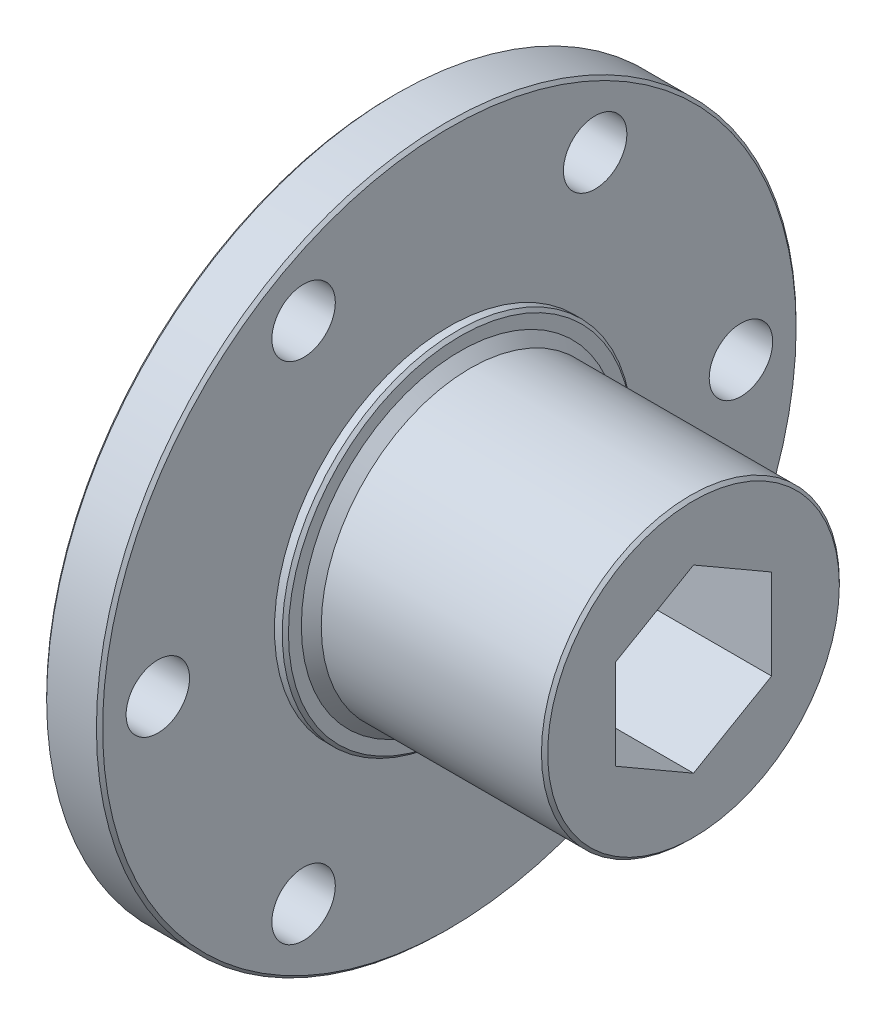
ISO-10303-21;
HEADER;
FILE_DESCRIPTION(('STEP AP214'),'2;1');
FILE_NAME('part.step','',(''),(''),'','','');
FILE_SCHEMA(('AUTOMOTIVE_DESIGN { 1 0 10303 214 1 1 1 1 }'));
ENDSEC;
DATA;
#1=APPLICATION_CONTEXT('core data for automotive mechanical design processes');
#2=APPLICATION_PROTOCOL_DEFINITION('international standard','automotive_design',2000,#1);
#3=PRODUCT_CONTEXT('',#1,'mechanical');
#4=PRODUCT('Part','Part','',(#3));
#5=PRODUCT_RELATED_PRODUCT_CATEGORY('part','',(#4));
#6=PRODUCT_DEFINITION_FORMATION('','',#4);
#7=PRODUCT_DEFINITION_CONTEXT('part definition',#1,'design');
#8=PRODUCT_DEFINITION('design','',#6,#7);
#9=PRODUCT_DEFINITION_SHAPE('','',#8);
#10=(LENGTH_UNIT() NAMED_UNIT(*) SI_UNIT(.MILLI.,.METRE.));
#11=(NAMED_UNIT(*) PLANE_ANGLE_UNIT() SI_UNIT($,.RADIAN.));
#12=(NAMED_UNIT(*) SI_UNIT($,.STERADIAN.) SOLID_ANGLE_UNIT());
#13=UNCERTAINTY_MEASURE_WITH_UNIT(LENGTH_MEASURE(1.E-05),#10,'distance_accuracy_value','');
#14=(GEOMETRIC_REPRESENTATION_CONTEXT(3) GLOBAL_UNCERTAINTY_ASSIGNED_CONTEXT((#13)) GLOBAL_UNIT_ASSIGNED_CONTEXT((#10,
#11,#12)) REPRESENTATION_CONTEXT('',''));
#15=CARTESIAN_POINT('',(0.,0.,0.));
#16=DIRECTION('',(0.,0.,1.));
#17=DIRECTION('',(1.,0.,0.));
#18=AXIS2_PLACEMENT_3D('',#15,#16,#17);
#19=CARTESIAN_POINT('',(-13.9240662460568,0.,0.));
#20=DIRECTION('',(-1.,0.,0.));
#21=DIRECTION('',(0.,0.,1.));
#22=AXIS2_PLACEMENT_3D('',#19,#20,#21);
#23=CYLINDRICAL_SURFACE('',#22,28.575);
#24=CARTESIAN_POINT('',(-14.1780662460568,0.,0.));
#25=DIRECTION('',(1.,0.,0.));
#26=DIRECTION('',(0.,0.,-1.));
#27=AXIS2_PLACEMENT_3D('',#24,#25,#26);
#28=CIRCLE('',#27,28.575);
#29=CARTESIAN_POINT('',(-14.1780662460568,0.,-28.575));
#30=VERTEX_POINT('',#29);
#31=EDGE_CURVE('E176',#30,#30,#28,.F.);
#32=ORIENTED_EDGE('',*,*,#31,.T.);
#33=EDGE_LOOP('',(#32));
#34=FACE_BOUND('',#33,.T.);
#35=CARTESIAN_POINT('',(-18.2420662460568,0.,0.));
#36=DIRECTION('',(-1.,0.,0.));
#37=DIRECTION('',(0.,0.,1.));
#38=AXIS2_PLACEMENT_3D('',#35,#36,#37);
#39=CIRCLE('',#38,28.575);
#40=CARTESIAN_POINT('',(-18.2420662460568,0.,28.575));
#41=VERTEX_POINT('',#40);
#42=EDGE_CURVE('E173',#41,#41,#39,.F.);
#43=ORIENTED_EDGE('',*,*,#42,.T.);
#44=EDGE_LOOP('',(#43));
#45=FACE_BOUND('',#44,.T.);
#46=ADVANCED_FACE('F36',(#34,#45),#23,.T.);
#47=CARTESIAN_POINT('',(-13.9240662460568,28.575,0.));
#48=DIRECTION('',(1.,0.,0.));
#49=DIRECTION('',(0.,0.,-1.));
#50=AXIS2_PLACEMENT_3D('',#47,#48,#49);
#51=PLANE('',#50);
#52=CARTESIAN_POINT('',(-13.9240662460568,0.,0.));
#53=DIRECTION('',(1.,0.,0.));
#54=DIRECTION('',(0.,0.,-1.));
#55=AXIS2_PLACEMENT_3D('',#52,#53,#54);
#56=CIRCLE('',#55,28.321);
#57=CARTESIAN_POINT('',(-13.9240662460568,0.,-28.321));
#58=VERTEX_POINT('',#57);
#59=EDGE_CURVE('E44',#58,#58,#56,.T.);
#60=ORIENTED_EDGE('',*,*,#59,.T.);
#61=EDGE_LOOP('',(#60));
#62=FACE_BOUND('',#61,.T.);
#63=CARTESIAN_POINT('',(-13.9240662460568,-20.6222299276169,11.90625));
#64=DIRECTION('',(1.,0.,0.));
#65=DIRECTION('',(0.,0.,-1.));
#66=AXIS2_PLACEMENT_3D('',#63,#64,#65);
#67=CIRCLE('',#66,2.59079999999999);
#68=CARTESIAN_POINT('',(-13.9240662460568,-20.6222299276169,9.31545000000001));
#69=VERTEX_POINT('',#68);
#70=EDGE_CURVE('E518',#69,#69,#67,.T.);
#71=ORIENTED_EDGE('',*,*,#70,.F.);
#72=EDGE_LOOP('',(#71));
#73=FACE_BOUND('',#72,.T.);
#74=CARTESIAN_POINT('',(-13.9240662460568,-20.6222299276169,-11.90625));
#75=DIRECTION('',(1.,0.,0.));
#76=DIRECTION('',(0.,0.,-1.));
#77=AXIS2_PLACEMENT_3D('',#74,#75,#76);
#78=CIRCLE('',#77,2.59079999999999);
#79=CARTESIAN_POINT('',(-13.9240662460568,-20.6222299276169,-14.49705));
#80=VERTEX_POINT('',#79);
#81=EDGE_CURVE('E514',#80,#80,#78,.T.);
#82=ORIENTED_EDGE('',*,*,#81,.F.);
#83=EDGE_LOOP('',(#82));
#84=FACE_BOUND('',#83,.T.);
#85=CARTESIAN_POINT('',(-13.9240662460568,0.,-23.8125));
#86=DIRECTION('',(1.,0.,0.));
#87=DIRECTION('',(0.,0.,-1.));
#88=AXIS2_PLACEMENT_3D('',#85,#86,#87);
#89=CIRCLE('',#88,2.59079999999999);
#90=CARTESIAN_POINT('',(-13.9240662460568,0.,-26.4033));
#91=VERTEX_POINT('',#90);
#92=EDGE_CURVE('E510',#91,#91,#89,.T.);
#93=ORIENTED_EDGE('',*,*,#92,.F.);
#94=EDGE_LOOP('',(#93));
#95=FACE_BOUND('',#94,.T.);
#96=CARTESIAN_POINT('',(-13.9240662460568,20.6222299276169,-11.90625));
#97=DIRECTION('',(1.,0.,0.));
#98=DIRECTION('',(0.,0.,-1.));
#99=AXIS2_PLACEMENT_3D('',#96,#97,#98);
#100=CIRCLE('',#99,2.59079999999999);
#101=CARTESIAN_POINT('',(-13.9240662460568,20.6222299276169,-14.49705));
#102=VERTEX_POINT('',#101);
#103=EDGE_CURVE('E506',#102,#102,#100,.T.);
#104=ORIENTED_EDGE('',*,*,#103,.F.);
#105=EDGE_LOOP('',(#104));
#106=FACE_BOUND('',#105,.T.);
#107=CARTESIAN_POINT('',(-13.9240662460568,20.6222299276169,11.90625));
#108=DIRECTION('',(1.,0.,0.));
#109=DIRECTION('',(0.,0.,-1.));
#110=AXIS2_PLACEMENT_3D('',#107,#108,#109);
#111=CIRCLE('',#110,2.59079999999999);
#112=CARTESIAN_POINT('',(-13.9240662460568,20.6222299276169,9.31545000000001));
#113=VERTEX_POINT('',#112);
#114=EDGE_CURVE('E501',#113,#113,#111,.T.);
#115=ORIENTED_EDGE('',*,*,#114,.F.);
#116=EDGE_LOOP('',(#115));
#117=FACE_BOUND('',#116,.T.);
#118=CARTESIAN_POINT('',(-13.9240662460568,0.,23.8125));
#119=DIRECTION('',(1.,0.,0.));
#120=DIRECTION('',(0.,0.,-1.));
#121=AXIS2_PLACEMENT_3D('',#118,#119,#120);
#122=CIRCLE('',#121,2.59079999999999);
#123=CARTESIAN_POINT('',(-13.9240662460568,0.,21.2217));
#124=VERTEX_POINT('',#123);
#125=EDGE_CURVE('E113',#124,#124,#122,.T.);
#126=ORIENTED_EDGE('',*,*,#125,.F.);
#127=EDGE_LOOP('',(#126));
#128=FACE_BOUND('',#127,.T.);
#129=CARTESIAN_POINT('',(-13.9240662460568,0.,0.));
#130=DIRECTION('',(1.,0.,0.));
#131=DIRECTION('',(0.,0.,-1.));
#132=AXIS2_PLACEMENT_3D('',#129,#130,#131);
#133=CIRCLE('',#132,14.2875);
#134=CARTESIAN_POINT('',(-13.9240662460568,0.,-14.2875));
#135=VERTEX_POINT('',#134);
#136=EDGE_CURVE('E148',#135,#135,#133,.T.);
#137=ORIENTED_EDGE('',*,*,#136,.F.);
#138=EDGE_LOOP('',(#137));
#139=FACE_BOUND('',#138,.T.);
#140=ADVANCED_FACE('F181',(#62,#73,#84,#95,#106,#117,#128,#139),#51,.T.);
#141=CARTESIAN_POINT('',(-18.4960662460568,0.,0.));
#142=DIRECTION('',(-1.,0.,0.));
#143=DIRECTION('',(0.,0.,1.));
#144=AXIS2_PLACEMENT_3D('',#141,#142,#143);
#145=PLANE('',#144);
#146=CARTESIAN_POINT('',(-18.4960662460568,0.,0.));
#147=DIRECTION('',(-1.,0.,0.));
#148=DIRECTION('',(0.,0.,1.));
#149=AXIS2_PLACEMENT_3D('',#146,#147,#148);
#150=CIRCLE('',#149,28.321);
#151=CARTESIAN_POINT('',(-18.4960662460568,0.,28.321));
#152=VERTEX_POINT('',#151);
#153=EDGE_CURVE('E11',#152,#152,#150,.T.);
#154=ORIENTED_EDGE('',*,*,#153,.T.);
#155=EDGE_LOOP('',(#154));
#156=FACE_BOUND('',#155,.T.);
#157=CARTESIAN_POINT('',(-18.4960662460568,-20.6222299276169,11.90625));
#158=DIRECTION('',(-1.,0.,0.));
#159=DIRECTION('',(0.,0.,1.));
#160=AXIS2_PLACEMENT_3D('',#157,#158,#159);
#161=CIRCLE('',#160,2.59079999999999);
#162=CARTESIAN_POINT('',(-18.4960662460568,-20.6222299276169,14.49705));
#163=VERTEX_POINT('',#162);
#164=EDGE_CURVE('E207',#163,#163,#161,.T.);
#165=ORIENTED_EDGE('',*,*,#164,.F.);
#166=EDGE_LOOP('',(#165));
#167=FACE_BOUND('',#166,.T.);
#168=CARTESIAN_POINT('',(-18.4960662460568,-20.6222299276169,-11.90625));
#169=DIRECTION('',(-1.,0.,0.));
#170=DIRECTION('',(0.,0.,1.));
#171=AXIS2_PLACEMENT_3D('',#168,#169,#170);
#172=CIRCLE('',#171,2.59079999999999);
#173=CARTESIAN_POINT('',(-18.4960662460568,-20.6222299276169,-9.31545000000001));
#174=VERTEX_POINT('',#173);
#175=EDGE_CURVE('E211',#174,#174,#172,.T.);
#176=ORIENTED_EDGE('',*,*,#175,.F.);
#177=EDGE_LOOP('',(#176));
#178=FACE_BOUND('',#177,.T.);
#179=CARTESIAN_POINT('',(-18.4960662460568,0.,-23.8125));
#180=DIRECTION('',(-1.,0.,0.));
#181=DIRECTION('',(0.,0.,1.));
#182=AXIS2_PLACEMENT_3D('',#179,#180,#181);
#183=CIRCLE('',#182,2.59079999999999);
#184=CARTESIAN_POINT('',(-18.4960662460568,0.,-21.2217));
#185=VERTEX_POINT('',#184);
#186=EDGE_CURVE('E215',#185,#185,#183,.T.);
#187=ORIENTED_EDGE('',*,*,#186,.F.);
#188=EDGE_LOOP('',(#187));
#189=FACE_BOUND('',#188,.T.);
#190=CARTESIAN_POINT('',(-18.4960662460568,20.6222299276169,-11.90625));
#191=DIRECTION('',(-1.,0.,0.));
#192=DIRECTION('',(0.,0.,1.));
#193=AXIS2_PLACEMENT_3D('',#190,#191,#192);
#194=CIRCLE('',#193,2.59079999999999);
#195=CARTESIAN_POINT('',(-18.4960662460568,20.6222299276169,-9.31545000000001));
#196=VERTEX_POINT('',#195);
#197=EDGE_CURVE('E219',#196,#196,#194,.T.);
#198=ORIENTED_EDGE('',*,*,#197,.F.);
#199=EDGE_LOOP('',(#198));
#200=FACE_BOUND('',#199,.T.);
#201=CARTESIAN_POINT('',(-18.4960662460568,20.6222299276169,11.90625));
#202=DIRECTION('',(-1.,0.,0.));
#203=DIRECTION('',(0.,0.,1.));
#204=AXIS2_PLACEMENT_3D('',#201,#202,#203);
#205=CIRCLE('',#204,2.59079999999999);
#206=CARTESIAN_POINT('',(-18.4960662460568,20.6222299276169,14.49705));
#207=VERTEX_POINT('',#206);
#208=EDGE_CURVE('E223',#207,#207,#205,.T.);
#209=ORIENTED_EDGE('',*,*,#208,.F.);
#210=EDGE_LOOP('',(#209));
#211=FACE_BOUND('',#210,.T.);
#212=CARTESIAN_POINT('',(-18.4960662460568,0.,23.8125));
#213=DIRECTION('',(-1.,0.,0.));
#214=DIRECTION('',(0.,0.,1.));
#215=AXIS2_PLACEMENT_3D('',#212,#213,#214);
#216=CIRCLE('',#215,2.59079999999999);
#217=CARTESIAN_POINT('',(-18.4960662460568,0.,26.4033));
#218=VERTEX_POINT('',#217);
#219=EDGE_CURVE('E227',#218,#218,#216,.T.);
#220=ORIENTED_EDGE('',*,*,#219,.F.);
#221=EDGE_LOOP('',(#220));
#222=FACE_BOUND('',#221,.T.);
#223=CARTESIAN_POINT('',(-18.4960662460568,0.,0.));
#224=DIRECTION('',(-1.,0.,0.));
#225=DIRECTION('',(0.,0.,1.));
#226=AXIS2_PLACEMENT_3D('',#223,#224,#225);
#227=CIRCLE('',#226,14.2875);
#228=CARTESIAN_POINT('',(-18.4960662460568,0.,14.2875));
#229=VERTEX_POINT('',#228);
#230=EDGE_CURVE('E151',#229,#229,#227,.T.);
#231=ORIENTED_EDGE('',*,*,#230,.F.);
#232=EDGE_LOOP('',(#231));
#233=FACE_BOUND('',#232,.T.);
#234=ADVANCED_FACE('F199',(#156,#167,#178,#189,#200,#211,#222,#233),#145,.T.);
#235=CARTESIAN_POINT('',(-19.3850662460567,0.,0.));
#236=DIRECTION('',(1.,0.,0.));
#237=DIRECTION('',(0.,0.,-1.));
#238=AXIS2_PLACEMENT_3D('',#235,#236,#237);
#239=CYLINDRICAL_SURFACE('',#238,14.2875);
#240=CARTESIAN_POINT('',(-19.1310662460567,0.,0.));
#241=DIRECTION('',(-1.,0.,0.));
#242=DIRECTION('',(0.,0.,1.));
#243=AXIS2_PLACEMENT_3D('',#240,#241,#242);
#244=CIRCLE('',#243,14.2875);
#245=CARTESIAN_POINT('',(-19.1310662460567,0.,14.2875));
#246=VERTEX_POINT('',#245);
#247=EDGE_CURVE('E170',#246,#246,#244,.F.);
#248=ORIENTED_EDGE('',*,*,#247,.T.);
#249=EDGE_LOOP('',(#248));
#250=FACE_BOUND('',#249,.T.);
#251=ORIENTED_EDGE('',*,*,#230,.T.);
#252=EDGE_LOOP('',(#251));
#253=FACE_BOUND('',#252,.T.);
#254=ADVANCED_FACE('F202',(#250,#253),#239,.T.);
#255=CARTESIAN_POINT('',(-19.3850662460567,0.,0.));
#256=DIRECTION('',(-1.,0.,0.));
#257=DIRECTION('',(0.,0.,1.));
#258=AXIS2_PLACEMENT_3D('',#255,#256,#257);
#259=PLANE('',#258);
#260=CARTESIAN_POINT('',(-19.3850662460567,0.,0.));
#261=DIRECTION('',(-1.,0.,0.));
#262=DIRECTION('',(0.,0.,1.));
#263=AXIS2_PLACEMENT_3D('',#260,#261,#262);
#264=CIRCLE('',#263,14.0335);
#265=CARTESIAN_POINT('',(-19.3850662460567,0.,14.0335));
#266=VERTEX_POINT('',#265);
#267=EDGE_CURVE('E167',#266,#266,#264,.T.);
#268=ORIENTED_EDGE('',*,*,#267,.T.);
#269=EDGE_LOOP('',(#268));
#270=FACE_BOUND('',#269,.T.);
#271=DIRECTION('',(0.,-0.500000000000001,-0.866025403784438));
#272=VECTOR('',#271,1.);
#273=CARTESIAN_POINT('',(-19.3850662460568,-3.68085890619153,6.3754));
#274=LINE('',#273,#272);
#275=CARTESIAN_POINT('',(-19.3850662460568,-3.68085890619153,6.3754));
#276=VERTEX_POINT('',#275);
#277=CARTESIAN_POINT('',(-19.3850662460568,-7.36169781238308,0.));
#278=VERTEX_POINT('',#277);
#279=EDGE_CURVE('E91',#276,#278,#274,.T.);
#280=ORIENTED_EDGE('',*,*,#279,.T.);
#281=DIRECTION('',(0.,0.500000000000001,-0.866025403784438));
#282=VECTOR('',#281,1.);
#283=CARTESIAN_POINT('',(-19.3850662460568,-7.36169781238308,0.));
#284=LINE('',#283,#282);
#285=CARTESIAN_POINT('',(-19.3850662460567,-3.68085890619153,-6.3754));
#286=VERTEX_POINT('',#285);
#287=EDGE_CURVE('E100',#278,#286,#284,.T.);
#288=ORIENTED_EDGE('',*,*,#287,.T.);
#289=DIRECTION('',(0.,1.,0.));
#290=VECTOR('',#289,1.);
#291=CARTESIAN_POINT('',(-19.3850662460568,-3.68085890619153,-6.3754));
#292=LINE('',#291,#290);
#293=CARTESIAN_POINT('',(-19.3850662460568,3.68081890619155,-6.3754));
#294=VERTEX_POINT('',#293);
#295=EDGE_CURVE('E51',#286,#294,#292,.T.);
#296=ORIENTED_EDGE('',*,*,#295,.T.);
#297=DIRECTION('',(0.,0.500000000000001,0.866025403784438));
#298=VECTOR('',#297,1.);
#299=CARTESIAN_POINT('',(-19.3850662460568,3.68081890619155,-6.3754));
#300=LINE('',#299,#298);
#301=CARTESIAN_POINT('',(-19.3850662460568,7.3616578123831,0.));
#302=VERTEX_POINT('',#301);
#303=EDGE_CURVE('E117',#294,#302,#300,.T.);
#304=ORIENTED_EDGE('',*,*,#303,.T.);
#305=DIRECTION('',(0.,-0.500000000000002,0.866025403784438));
#306=VECTOR('',#305,1.);
#307=CARTESIAN_POINT('',(-19.3850662460568,7.3616578123831,0.));
#308=LINE('',#307,#306);
#309=CARTESIAN_POINT('',(-19.3850662460568,3.68081890619155,6.3754));
#310=VERTEX_POINT('',#309);
#311=EDGE_CURVE('E120',#302,#310,#308,.T.);
#312=ORIENTED_EDGE('',*,*,#311,.T.);
#313=DIRECTION('',(0.,-1.,0.));
#314=VECTOR('',#313,1.);
#315=CARTESIAN_POINT('',(-19.3850662460568,3.68081890619155,6.3754));
#316=LINE('',#315,#314);
#317=EDGE_CURVE('E97',#310,#276,#316,.T.);
#318=ORIENTED_EDGE('',*,*,#317,.T.);
#319=EDGE_LOOP('',(#280,#288,#296,#304,#312,#318));
#320=FACE_BOUND('',#319,.T.);
#321=ADVANCED_FACE('F104',(#270,#320),#259,.T.);
#322=CARTESIAN_POINT('',(-13.0350662460568,0.,0.));
#323=DIRECTION('',(-1.,0.,0.));
#324=DIRECTION('',(0.,0.,1.));
#325=AXIS2_PLACEMENT_3D('',#322,#323,#324);
#326=CYLINDRICAL_SURFACE('',#325,14.2875);
#327=CARTESIAN_POINT('',(-13.2890662460568,0.,0.));
#328=DIRECTION('',(1.,0.,0.));
#329=DIRECTION('',(0.,0.,-1.));
#330=AXIS2_PLACEMENT_3D('',#327,#328,#329);
#331=CIRCLE('',#330,14.2875);
#332=CARTESIAN_POINT('',(-13.2890662460568,0.,-14.2875));
#333=VERTEX_POINT('',#332);
#334=EDGE_CURVE('E158',#333,#333,#331,.F.);
#335=ORIENTED_EDGE('',*,*,#334,.T.);
#336=EDGE_LOOP('',(#335));
#337=FACE_BOUND('',#336,.T.);
#338=ORIENTED_EDGE('',*,*,#136,.T.);
#339=EDGE_LOOP('',(#338));
#340=FACE_BOUND('',#339,.T.);
#341=ADVANCED_FACE('F236',(#337,#340),#326,.T.);
#342=CARTESIAN_POINT('',(-13.0350662460568,0.,0.));
#343=DIRECTION('',(1.,0.,0.));
#344=DIRECTION('',(0.,0.,-1.));
#345=AXIS2_PLACEMENT_3D('',#342,#343,#344);
#346=PLANE('',#345);
#347=CARTESIAN_POINT('',(-13.0350662460568,0.,0.));
#348=DIRECTION('',(1.,0.,0.));
#349=DIRECTION('',(0.,0.,-1.));
#350=AXIS2_PLACEMENT_3D('',#347,#348,#349);
#351=CIRCLE('',#350,14.0335);
#352=CARTESIAN_POINT('',(-13.0350662460568,0.,-14.0335));
#353=VERTEX_POINT('',#352);
#354=EDGE_CURVE('E147',#353,#353,#351,.T.);
#355=ORIENTED_EDGE('',*,*,#354,.T.);
#356=EDGE_LOOP('',(#355));
#357=FACE_BOUND('',#356,.T.);
#358=CARTESIAN_POINT('',(-13.0350662460568,0.,0.));
#359=DIRECTION('',(1.,0.,0.));
#360=DIRECTION('',(0.,0.,-1.));
#361=AXIS2_PLACEMENT_3D('',#358,#359,#360);
#362=CIRCLE('',#361,12.9794);
#363=CARTESIAN_POINT('',(-13.0350662460568,0.,-12.9794));
#364=VERTEX_POINT('',#363);
#365=EDGE_CURVE('E144',#364,#364,#362,.T.);
#366=ORIENTED_EDGE('',*,*,#365,.F.);
#367=EDGE_LOOP('',(#366));
#368=FACE_BOUND('',#367,.T.);
#369=ADVANCED_FACE('F415',(#357,#368),#346,.T.);
#370=CARTESIAN_POINT('',(-13.0350662460568,0.,0.));
#371=DIRECTION('',(-1.,0.,0.));
#372=DIRECTION('',(0.,0.,-1.));
#373=AXIS2_PLACEMENT_3D('',#370,#371,#372);
#374=CONICAL_SURFACE('',#373,12.9794,0.785398163397434);
#375=CARTESIAN_POINT('',(-12.2222662460567,0.,0.));
#376=DIRECTION('',(1.,0.,0.));
#377=DIRECTION('',(0.,0.,-1.));
#378=AXIS2_PLACEMENT_3D('',#375,#376,#377);
#379=CIRCLE('',#378,12.1666);
#380=CARTESIAN_POINT('',(-12.2222662460567,0.,-12.1666));
#381=VERTEX_POINT('',#380);
#382=EDGE_CURVE('E136',#381,#381,#379,.T.);
#383=ORIENTED_EDGE('',*,*,#382,.F.);
#384=EDGE_LOOP('',(#383));
#385=FACE_BOUND('',#384,.T.);
#386=ORIENTED_EDGE('',*,*,#365,.T.);
#387=EDGE_LOOP('',(#386));
#388=FACE_BOUND('',#387,.T.);
#389=ADVANCED_FACE('F406',(#385,#388),#374,.T.);
#390=CARTESIAN_POINT('',(6.01493375394323,0.,0.));
#391=DIRECTION('',(-1.,0.,0.));
#392=DIRECTION('',(0.,0.,1.));
#393=AXIS2_PLACEMENT_3D('',#390,#391,#392);
#394=CYLINDRICAL_SURFACE('',#393,12.1666);
#395=CARTESIAN_POINT('',(5.76093375394319,0.,0.));
#396=DIRECTION('',(1.,0.,0.));
#397=DIRECTION('',(0.,0.,-1.));
#398=AXIS2_PLACEMENT_3D('',#395,#396,#397);
#399=CIRCLE('',#398,12.1666);
#400=CARTESIAN_POINT('',(5.76093375394319,0.,-12.1666));
#401=VERTEX_POINT('',#400);
#402=EDGE_CURVE('E164',#401,#401,#399,.F.);
#403=ORIENTED_EDGE('',*,*,#402,.T.);
#404=EDGE_LOOP('',(#403));
#405=FACE_BOUND('',#404,.T.);
#406=ORIENTED_EDGE('',*,*,#382,.T.);
#407=EDGE_LOOP('',(#406));
#408=FACE_BOUND('',#407,.T.);
#409=ADVANCED_FACE('F397',(#405,#408),#394,.T.);
#410=CARTESIAN_POINT('',(6.01493375394323,0.,0.));
#411=DIRECTION('',(1.,0.,0.));
#412=DIRECTION('',(0.,0.,-1.));
#413=AXIS2_PLACEMENT_3D('',#410,#411,#412);
#414=PLANE('',#413);
#415=CARTESIAN_POINT('',(6.01493375394323,0.,0.));
#416=DIRECTION('',(1.,0.,0.));
#417=DIRECTION('',(0.,0.,-1.));
#418=AXIS2_PLACEMENT_3D('',#415,#416,#417);
#419=CIRCLE('',#418,11.9126);
#420=CARTESIAN_POINT('',(6.01493375394323,0.,-11.9126));
#421=VERTEX_POINT('',#420);
#422=EDGE_CURVE('E161',#421,#421,#419,.T.);
#423=ORIENTED_EDGE('',*,*,#422,.T.);
#424=EDGE_LOOP('',(#423));
#425=FACE_BOUND('',#424,.T.);
#426=DIRECTION('',(0.,-0.500000000000001,-0.866025403784438));
#427=VECTOR('',#426,1.);
#428=CARTESIAN_POINT('',(6.01493375394323,-3.68085890619153,6.3754));
#429=LINE('',#428,#427);
#430=CARTESIAN_POINT('',(6.01493375394323,-3.68085890619153,6.3754));
#431=VERTEX_POINT('',#430);
#432=CARTESIAN_POINT('',(6.01493375394323,-7.36169781238308,0.));
#433=VERTEX_POINT('',#432);
#434=EDGE_CURVE('E59',#431,#433,#429,.T.);
#435=ORIENTED_EDGE('',*,*,#434,.F.);
#436=DIRECTION('',(0.,-1.,0.));
#437=VECTOR('',#436,1.);
#438=CARTESIAN_POINT('',(6.01493375394323,3.68081890619155,6.3754));
#439=LINE('',#438,#437);
#440=CARTESIAN_POINT('',(6.01493375394323,3.68081890619155,6.3754));
#441=VERTEX_POINT('',#440);
#442=EDGE_CURVE('E107',#441,#431,#439,.T.);
#443=ORIENTED_EDGE('',*,*,#442,.F.);
#444=DIRECTION('',(0.,-0.500000000000002,0.866025403784438));
#445=VECTOR('',#444,1.);
#446=CARTESIAN_POINT('',(6.01493375394323,7.3616578123831,0.));
#447=LINE('',#446,#445);
#448=CARTESIAN_POINT('',(6.01493375394323,7.3616578123831,0.));
#449=VERTEX_POINT('',#448);
#450=EDGE_CURVE('E110',#449,#441,#447,.T.);
#451=ORIENTED_EDGE('',*,*,#450,.F.);
#452=DIRECTION('',(0.,0.500000000000001,0.866025403784438));
#453=VECTOR('',#452,1.);
#454=CARTESIAN_POINT('',(6.01493375394323,3.68081890619155,-6.3754));
#455=LINE('',#454,#453);
#456=CARTESIAN_POINT('',(6.01493375394323,3.68081890619155,-6.3754));
#457=VERTEX_POINT('',#456);
#458=EDGE_CURVE('E129',#457,#449,#455,.T.);
#459=ORIENTED_EDGE('',*,*,#458,.F.);
#460=DIRECTION('',(0.,1.,0.));
#461=VECTOR('',#460,1.);
#462=CARTESIAN_POINT('',(6.01493375394323,-3.68085890619153,-6.3754));
#463=LINE('',#462,#461);
#464=CARTESIAN_POINT('',(6.01493375394323,-3.68085890619153,-6.3754));
#465=VERTEX_POINT('',#464);
#466=EDGE_CURVE('E126',#465,#457,#463,.T.);
#467=ORIENTED_EDGE('',*,*,#466,.F.);
#468=DIRECTION('',(0.,0.500000000000001,-0.866025403784438));
#469=VECTOR('',#468,1.);
#470=CARTESIAN_POINT('',(6.01493375394323,-7.36169781238308,0.));
#471=LINE('',#470,#469);
#472=EDGE_CURVE('E124',#433,#465,#471,.T.);
#473=ORIENTED_EDGE('',*,*,#472,.F.);
#474=EDGE_LOOP('',(#435,#443,#451,#459,#467,#473));
#475=FACE_BOUND('',#474,.T.);
#476=ADVANCED_FACE('F389',(#425,#475),#414,.T.);
#477=CARTESIAN_POINT('',(-19.3850662460568,-3.68085890619153,6.3754));
#478=DIRECTION('',(0.,-0.866025403784438,0.500000000000001));
#479=DIRECTION('',(0.,-0.500000000000001,-0.866025403784438));
#480=AXIS2_PLACEMENT_3D('',#477,#478,#479);
#481=PLANE('',#480);
#482=ORIENTED_EDGE('',*,*,#434,.T.);
#483=DIRECTION('',(1.,0.,0.));
#484=VECTOR('',#483,1.);
#485=CARTESIAN_POINT('',(-19.3850662460568,-7.36169781238308,0.));
#486=LINE('',#485,#484);
#487=EDGE_CURVE('E87',#278,#433,#486,.T.);
#488=ORIENTED_EDGE('',*,*,#487,.F.);
#489=ORIENTED_EDGE('',*,*,#279,.F.);
#490=DIRECTION('',(1.,0.,0.));
#491=VECTOR('',#490,1.);
#492=CARTESIAN_POINT('',(-19.3850662460568,-3.68085890619153,6.3754));
#493=LINE('',#492,#491);
#494=EDGE_CURVE('E134',#276,#431,#493,.T.);
#495=ORIENTED_EDGE('',*,*,#494,.T.);
#496=EDGE_LOOP('',(#482,#488,#489,#495));
#497=FACE_BOUND('',#496,.T.);
#498=ADVANCED_FACE('F89',(#497),#481,.F.);
#499=CARTESIAN_POINT('',(-19.3850662460568,3.68081890619155,6.3754));
#500=DIRECTION('',(0.,0.,1.));
#501=DIRECTION('',(1.,0.,0.));
#502=AXIS2_PLACEMENT_3D('',#499,#500,#501);
#503=PLANE('',#502);
#504=ORIENTED_EDGE('',*,*,#442,.T.);
#505=ORIENTED_EDGE('',*,*,#494,.F.);
#506=ORIENTED_EDGE('',*,*,#317,.F.);
#507=DIRECTION('',(1.,0.,0.));
#508=VECTOR('',#507,1.);
#509=CARTESIAN_POINT('',(-19.3850662460568,3.68081890619155,6.3754));
#510=LINE('',#509,#508);
#511=EDGE_CURVE('E137',#310,#441,#510,.T.);
#512=ORIENTED_EDGE('',*,*,#511,.T.);
#513=EDGE_LOOP('',(#504,#505,#506,#512));
#514=FACE_BOUND('',#513,.T.);
#515=ADVANCED_FACE('F372',(#514),#503,.F.);
#516=CARTESIAN_POINT('',(-19.3850662460568,7.3616578123831,0.));
#517=DIRECTION('',(0.,0.866025403784438,0.500000000000002));
#518=DIRECTION('',(0.,-0.500000000000002,0.866025403784438));
#519=AXIS2_PLACEMENT_3D('',#516,#517,#518);
#520=PLANE('',#519);
#521=ORIENTED_EDGE('',*,*,#450,.T.);
#522=ORIENTED_EDGE('',*,*,#511,.F.);
#523=ORIENTED_EDGE('',*,*,#311,.F.);
#524=DIRECTION('',(1.,0.,0.));
#525=VECTOR('',#524,1.);
#526=CARTESIAN_POINT('',(-19.3850662460568,7.3616578123831,0.));
#527=LINE('',#526,#525);
#528=EDGE_CURVE('E139',#302,#449,#527,.T.);
#529=ORIENTED_EDGE('',*,*,#528,.T.);
#530=EDGE_LOOP('',(#521,#522,#523,#529));
#531=FACE_BOUND('',#530,.T.);
#532=ADVANCED_FACE('F363',(#531),#520,.F.);
#533=CARTESIAN_POINT('',(-19.3850662460568,3.68081890619155,-6.3754));
#534=DIRECTION('',(0.,0.866025403784438,-0.500000000000001));
#535=DIRECTION('',(0.,0.500000000000001,0.866025403784438));
#536=AXIS2_PLACEMENT_3D('',#533,#534,#535);
#537=PLANE('',#536);
#538=ORIENTED_EDGE('',*,*,#458,.T.);
#539=ORIENTED_EDGE('',*,*,#528,.F.);
#540=ORIENTED_EDGE('',*,*,#303,.F.);
#541=DIRECTION('',(1.,0.,0.));
#542=VECTOR('',#541,1.);
#543=CARTESIAN_POINT('',(-19.3850662460568,3.68081890619155,-6.3754));
#544=LINE('',#543,#542);
#545=EDGE_CURVE('E141',#294,#457,#544,.T.);
#546=ORIENTED_EDGE('',*,*,#545,.T.);
#547=EDGE_LOOP('',(#538,#539,#540,#546));
#548=FACE_BOUND('',#547,.T.);
#549=ADVANCED_FACE('F355',(#548),#537,.F.);
#550=CARTESIAN_POINT('',(-19.3850662460568,-3.68085890619153,-6.3754));
#551=DIRECTION('',(0.,0.,-1.));
#552=DIRECTION('',(-1.,0.,0.));
#553=AXIS2_PLACEMENT_3D('',#550,#551,#552);
#554=PLANE('',#553);
#555=ORIENTED_EDGE('',*,*,#466,.T.);
#556=ORIENTED_EDGE('',*,*,#545,.F.);
#557=ORIENTED_EDGE('',*,*,#295,.F.);
#558=DIRECTION('',(1.,0.,0.));
#559=VECTOR('',#558,1.);
#560=CARTESIAN_POINT('',(-19.3850662460568,-3.68085890619153,-6.3754));
#561=LINE('',#560,#559);
#562=EDGE_CURVE('E96',#286,#465,#561,.T.);
#563=ORIENTED_EDGE('',*,*,#562,.T.);
#564=EDGE_LOOP('',(#555,#556,#557,#563));
#565=FACE_BOUND('',#564,.T.);
#566=ADVANCED_FACE('F347',(#565),#554,.F.);
#567=CARTESIAN_POINT('',(-19.3850662460568,-7.36169781238308,0.));
#568=DIRECTION('',(0.,-0.866025403784438,-0.500000000000001));
#569=DIRECTION('',(0.,0.500000000000001,-0.866025403784438));
#570=AXIS2_PLACEMENT_3D('',#567,#568,#569);
#571=PLANE('',#570);
#572=ORIENTED_EDGE('',*,*,#472,.T.);
#573=ORIENTED_EDGE('',*,*,#562,.F.);
#574=ORIENTED_EDGE('',*,*,#287,.F.);
#575=ORIENTED_EDGE('',*,*,#487,.T.);
#576=EDGE_LOOP('',(#572,#573,#574,#575));
#577=FACE_BOUND('',#576,.T.);
#578=ADVANCED_FACE('F101',(#577),#571,.F.);
#579=CARTESIAN_POINT('',(-18.4960662460568,0.,23.8125));
#580=DIRECTION('',(-1.,0.,0.));
#581=DIRECTION('',(0.,0.,1.));
#582=AXIS2_PLACEMENT_3D('',#579,#580,#581);
#583=CYLINDRICAL_SURFACE('',#582,2.59079999999999);
#584=ORIENTED_EDGE('',*,*,#125,.T.);
#585=EDGE_LOOP('',(#584));
#586=FACE_BOUND('',#585,.T.);
#587=ORIENTED_EDGE('',*,*,#219,.T.);
#588=EDGE_LOOP('',(#587));
#589=FACE_BOUND('',#588,.T.);
#590=ADVANCED_FACE('F330',(#586,#589),#583,.F.);
#591=CARTESIAN_POINT('',(-18.4960662460568,20.6222299276169,11.90625));
#592=DIRECTION('',(-1.,0.,0.));
#593=DIRECTION('',(0.,0.,1.));
#594=AXIS2_PLACEMENT_3D('',#591,#592,#593);
#595=CYLINDRICAL_SURFACE('',#594,2.59079999999999);
#596=ORIENTED_EDGE('',*,*,#114,.T.);
#597=EDGE_LOOP('',(#596));
#598=FACE_BOUND('',#597,.T.);
#599=ORIENTED_EDGE('',*,*,#208,.T.);
#600=EDGE_LOOP('',(#599));
#601=FACE_BOUND('',#600,.T.);
#602=ADVANCED_FACE('F321',(#598,#601),#595,.F.);
#603=CARTESIAN_POINT('',(-18.4960662460568,20.6222299276169,-11.90625));
#604=DIRECTION('',(-1.,0.,0.));
#605=DIRECTION('',(0.,0.,1.));
#606=AXIS2_PLACEMENT_3D('',#603,#604,#605);
#607=CYLINDRICAL_SURFACE('',#606,2.59079999999999);
#608=ORIENTED_EDGE('',*,*,#103,.T.);
#609=EDGE_LOOP('',(#608));
#610=FACE_BOUND('',#609,.T.);
#611=ORIENTED_EDGE('',*,*,#197,.T.);
#612=EDGE_LOOP('',(#611));
#613=FACE_BOUND('',#612,.T.);
#614=ADVANCED_FACE('F312',(#610,#613),#607,.F.);
#615=CARTESIAN_POINT('',(-18.4960662460568,0.,-23.8125));
#616=DIRECTION('',(-1.,0.,0.));
#617=DIRECTION('',(0.,0.,1.));
#618=AXIS2_PLACEMENT_3D('',#615,#616,#617);
#619=CYLINDRICAL_SURFACE('',#618,2.59079999999999);
#620=ORIENTED_EDGE('',*,*,#92,.T.);
#621=EDGE_LOOP('',(#620));
#622=FACE_BOUND('',#621,.T.);
#623=ORIENTED_EDGE('',*,*,#186,.T.);
#624=EDGE_LOOP('',(#623));
#625=FACE_BOUND('',#624,.T.);
#626=ADVANCED_FACE('F303',(#622,#625),#619,.F.);
#627=CARTESIAN_POINT('',(-18.4960662460568,-20.6222299276169,-11.90625));
#628=DIRECTION('',(-1.,0.,0.));
#629=DIRECTION('',(0.,0.,1.));
#630=AXIS2_PLACEMENT_3D('',#627,#628,#629);
#631=CYLINDRICAL_SURFACE('',#630,2.59079999999999);
#632=ORIENTED_EDGE('',*,*,#81,.T.);
#633=EDGE_LOOP('',(#632));
#634=FACE_BOUND('',#633,.T.);
#635=ORIENTED_EDGE('',*,*,#175,.T.);
#636=EDGE_LOOP('',(#635));
#637=FACE_BOUND('',#636,.T.);
#638=ADVANCED_FACE('F293',(#634,#637),#631,.F.);
#639=CARTESIAN_POINT('',(-18.4960662460568,-20.6222299276169,11.90625));
#640=DIRECTION('',(-1.,0.,0.));
#641=DIRECTION('',(0.,0.,1.));
#642=AXIS2_PLACEMENT_3D('',#639,#640,#641);
#643=CYLINDRICAL_SURFACE('',#642,2.59079999999999);
#644=ORIENTED_EDGE('',*,*,#70,.T.);
#645=EDGE_LOOP('',(#644));
#646=FACE_BOUND('',#645,.T.);
#647=ORIENTED_EDGE('',*,*,#164,.T.);
#648=EDGE_LOOP('',(#647));
#649=FACE_BOUND('',#648,.T.);
#650=ADVANCED_FACE('F247',(#646,#649),#643,.F.);
#651=CARTESIAN_POINT('',(-13.0350662460568,0.,0.));
#652=DIRECTION('',(-1.,0.,0.));
#653=DIRECTION('',(0.,0.,1.));
#654=AXIS2_PLACEMENT_3D('',#651,#652,#653);
#655=CONICAL_SURFACE('',#654,14.0335,0.785398163397452);
#656=ORIENTED_EDGE('',*,*,#334,.F.);
#657=EDGE_LOOP('',(#656));
#658=FACE_BOUND('',#657,.T.);
#659=ORIENTED_EDGE('',*,*,#354,.F.);
#660=EDGE_LOOP('',(#659));
#661=FACE_BOUND('',#660,.T.);
#662=ADVANCED_FACE('F243',(#658,#661),#655,.T.);
#663=CARTESIAN_POINT('',(6.01493375394323,0.,0.));
#664=DIRECTION('',(-1.,0.,0.));
#665=DIRECTION('',(0.,0.,1.));
#666=AXIS2_PLACEMENT_3D('',#663,#664,#665);
#667=CONICAL_SURFACE('',#666,11.9126,0.785398163397452);
#668=ORIENTED_EDGE('',*,*,#402,.F.);
#669=EDGE_LOOP('',(#668));
#670=FACE_BOUND('',#669,.T.);
#671=ORIENTED_EDGE('',*,*,#422,.F.);
#672=EDGE_LOOP('',(#671));
#673=FACE_BOUND('',#672,.T.);
#674=ADVANCED_FACE('F246',(#670,#673),#667,.T.);
#675=CARTESIAN_POINT('',(-19.3850662460567,0.,0.));
#676=DIRECTION('',(1.,0.,0.));
#677=DIRECTION('',(0.,0.,-1.));
#678=AXIS2_PLACEMENT_3D('',#675,#676,#677);
#679=CONICAL_SURFACE('',#678,14.0335,0.785398163397452);
#680=ORIENTED_EDGE('',*,*,#247,.F.);
#681=EDGE_LOOP('',(#680));
#682=FACE_BOUND('',#681,.T.);
#683=ORIENTED_EDGE('',*,*,#267,.F.);
#684=EDGE_LOOP('',(#683));
#685=FACE_BOUND('',#684,.T.);
#686=ADVANCED_FACE('F187',(#682,#685),#679,.T.);
#687=CARTESIAN_POINT('',(-14.1780662460568,0.,0.));
#688=DIRECTION('',(-1.,0.,0.));
#689=DIRECTION('',(0.,0.,1.));
#690=AXIS2_PLACEMENT_3D('',#687,#688,#689);
#691=CONICAL_SURFACE('',#690,28.575,0.785398163397455);
#692=ORIENTED_EDGE('',*,*,#59,.F.);
#693=EDGE_LOOP('',(#692));
#694=FACE_BOUND('',#693,.T.);
#695=ORIENTED_EDGE('',*,*,#31,.F.);
#696=EDGE_LOOP('',(#695));
#697=FACE_BOUND('',#696,.T.);
#698=ADVANCED_FACE('F184',(#694,#697),#691,.T.);
#699=CARTESIAN_POINT('',(-18.4960662460568,0.,0.));
#700=DIRECTION('',(1.,0.,0.));
#701=DIRECTION('',(0.,0.,-1.));
#702=AXIS2_PLACEMENT_3D('',#699,#700,#701);
#703=CONICAL_SURFACE('',#702,28.321,0.785398163397442);
#704=ORIENTED_EDGE('',*,*,#42,.F.);
#705=EDGE_LOOP('',(#704));
#706=FACE_BOUND('',#705,.T.);
#707=ORIENTED_EDGE('',*,*,#153,.F.);
#708=EDGE_LOOP('',(#707));
#709=FACE_BOUND('',#708,.T.);
#710=ADVANCED_FACE('F38',(#706,#709),#703,.T.);
#711=CLOSED_SHELL('',(#46,#140,#234,#254,#321,#341,#369,#389,#409,#476,#498,#515,#532,#549,#566,
#578,#590,#602,#614,#626,#638,#650,#662,#674,#686,#698,#710));
#712=MANIFOLD_SOLID_BREP('B2',#711);
#713=ADVANCED_BREP_SHAPE_REPRESENTATION('',(#18,#712),#14);
#714=SHAPE_DEFINITION_REPRESENTATION(#9,#713);
ENDSEC;
END-ISO-10303-21;
